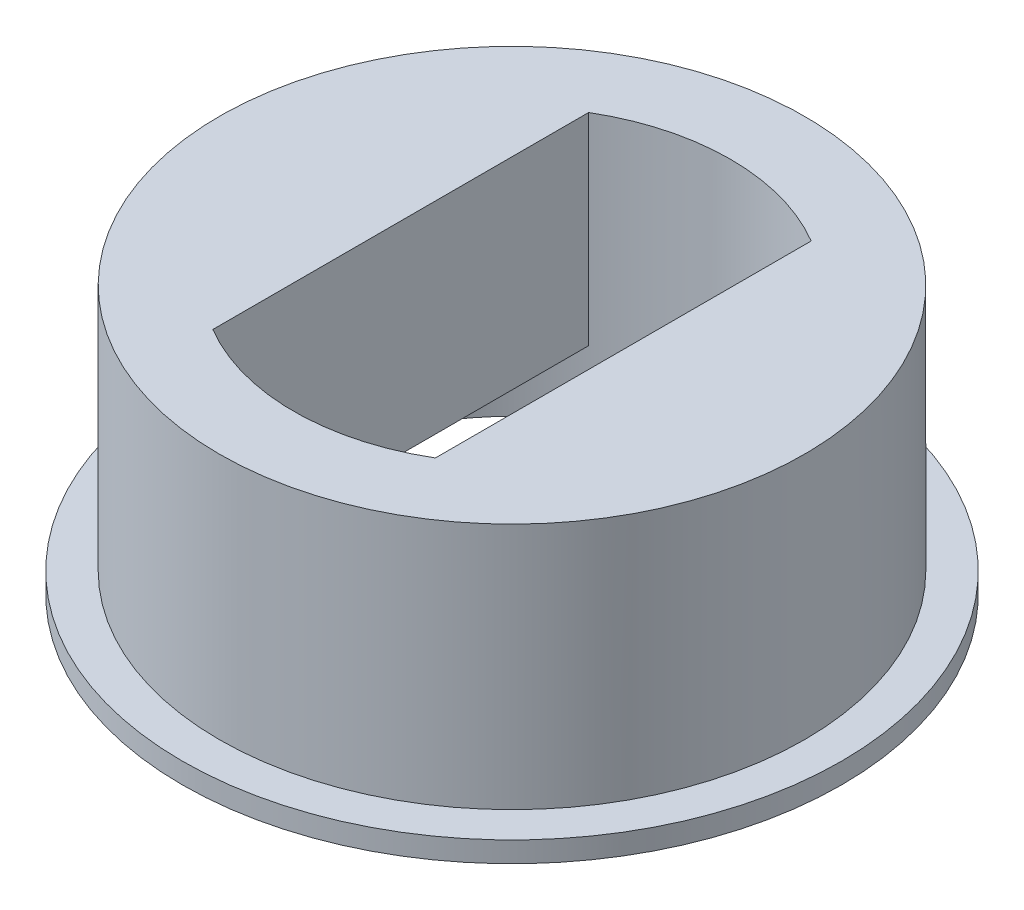
ISO-10303-21;
HEADER;
FILE_DESCRIPTION(('STEP AP214'),'2;1');
FILE_NAME('part.step','',(''),(''),'','','');
FILE_SCHEMA(('AUTOMOTIVE_DESIGN { 1 0 10303 214 1 1 1 1 }'));
ENDSEC;
DATA;
#1=APPLICATION_CONTEXT('core data for automotive mechanical design processes');
#2=APPLICATION_PROTOCOL_DEFINITION('international standard','automotive_design',2000,#1);
#3=PRODUCT_CONTEXT('',#1,'mechanical');
#4=PRODUCT('Part','Part','',(#3));
#5=PRODUCT_RELATED_PRODUCT_CATEGORY('part','',(#4));
#6=PRODUCT_DEFINITION_FORMATION('','',#4);
#7=PRODUCT_DEFINITION_CONTEXT('part definition',#1,'design');
#8=PRODUCT_DEFINITION('design','',#6,#7);
#9=PRODUCT_DEFINITION_SHAPE('','',#8);
#10=(LENGTH_UNIT() NAMED_UNIT(*) SI_UNIT(.MILLI.,.METRE.));
#11=(NAMED_UNIT(*) PLANE_ANGLE_UNIT() SI_UNIT($,.RADIAN.));
#12=(NAMED_UNIT(*) SI_UNIT($,.STERADIAN.) SOLID_ANGLE_UNIT());
#13=UNCERTAINTY_MEASURE_WITH_UNIT(LENGTH_MEASURE(1.E-05),#10,'distance_accuracy_value','');
#14=(GEOMETRIC_REPRESENTATION_CONTEXT(3) GLOBAL_UNCERTAINTY_ASSIGNED_CONTEXT((#13)) GLOBAL_UNIT_ASSIGNED_CONTEXT((#10,
#11,#12)) REPRESENTATION_CONTEXT('',''));
#15=CARTESIAN_POINT('',(0.,0.,0.));
#16=DIRECTION('',(0.,0.,1.));
#17=DIRECTION('',(1.,0.,0.));
#18=AXIS2_PLACEMENT_3D('',#15,#16,#17);
#19=CARTESIAN_POINT('',(0.,7.,0.));
#20=DIRECTION('',(0.,1.,0.));
#21=DIRECTION('',(0.,0.,1.));
#22=AXIS2_PLACEMENT_3D('',#19,#20,#21);
#23=PLANE('',#22);
#24=CARTESIAN_POINT('',(0.,7.,0.));
#25=DIRECTION('',(0.,1.,0.));
#26=DIRECTION('',(0.,0.,1.));
#27=AXIS2_PLACEMENT_3D('',#24,#25,#26);
#28=CIRCLE('',#27,7.1);
#29=CARTESIAN_POINT('',(0.,7.,7.1));
#30=VERTEX_POINT('',#29);
#31=EDGE_CURVE('E114',#30,#30,#28,.T.);
#32=ORIENTED_EDGE('',*,*,#31,.T.);
#33=EDGE_LOOP('',(#32));
#34=FACE_BOUND('',#33,.T.);
#35=DIRECTION('',(0.,0.,1.));
#36=VECTOR('',#35,1.);
#37=CARTESIAN_POINT('',(-2.7,7.,0.));
#38=LINE('',#37,#36);
#39=CARTESIAN_POINT('',(-2.7,7.,-4.55911584030947));
#40=VERTEX_POINT('',#39);
#41=CARTESIAN_POINT('',(-2.7,7.,4.55911584030947));
#42=VERTEX_POINT('',#41);
#43=EDGE_CURVE('E11',#40,#42,#38,.T.);
#44=ORIENTED_EDGE('',*,*,#43,.F.);
#45=CARTESIAN_POINT('',(0.,7.,0.));
#46=DIRECTION('',(0.,1.,0.));
#47=DIRECTION('',(0.,0.,1.));
#48=AXIS2_PLACEMENT_3D('',#45,#46,#47);
#49=CIRCLE('',#48,5.29863541351551);
#50=CARTESIAN_POINT('',(2.7,7.,-4.55911584030947));
#51=VERTEX_POINT('',#50);
#52=EDGE_CURVE('E106',#51,#40,#49,.T.);
#53=ORIENTED_EDGE('',*,*,#52,.F.);
#54=DIRECTION('',(0.,0.,1.));
#55=VECTOR('',#54,1.);
#56=CARTESIAN_POINT('',(2.7,7.,0.));
#57=LINE('',#56,#55);
#58=CARTESIAN_POINT('',(2.7,7.,4.55911584030947));
#59=VERTEX_POINT('',#58);
#60=EDGE_CURVE('E46',#51,#59,#57,.T.);
#61=ORIENTED_EDGE('',*,*,#60,.T.);
#62=CARTESIAN_POINT('',(0.,7.,0.));
#63=DIRECTION('',(0.,1.,0.));
#64=DIRECTION('',(0.,0.,1.));
#65=AXIS2_PLACEMENT_3D('',#62,#63,#64);
#66=CIRCLE('',#65,5.29863541351551);
#67=EDGE_CURVE('E91',#42,#59,#66,.T.);
#68=ORIENTED_EDGE('',*,*,#67,.F.);
#69=EDGE_LOOP('',(#44,#53,#61,#68));
#70=FACE_BOUND('',#69,.T.);
#71=ADVANCED_FACE('F38',(#34,#70),#23,.T.);
#72=CARTESIAN_POINT('',(0.,2.1,0.));
#73=DIRECTION('',(0.,-1.,0.));
#74=DIRECTION('',(0.,0.,-1.));
#75=AXIS2_PLACEMENT_3D('',#72,#73,#74);
#76=PLANE('',#75);
#77=CARTESIAN_POINT('',(0.,2.1,0.));
#78=DIRECTION('',(0.,-1.,0.));
#79=DIRECTION('',(0.,0.,-1.));
#80=AXIS2_PLACEMENT_3D('',#77,#78,#79);
#81=CIRCLE('',#80,5.29863541351551);
#82=CARTESIAN_POINT('',(-2.7,2.1,4.55911584030947));
#83=VERTEX_POINT('',#82);
#84=CARTESIAN_POINT('',(-2.7,2.1,-4.55911584030947));
#85=VERTEX_POINT('',#84);
#86=EDGE_CURVE('E99',#83,#85,#81,.T.);
#87=ORIENTED_EDGE('',*,*,#86,.T.);
#88=DIRECTION('',(0.,0.,1.));
#89=VECTOR('',#88,1.);
#90=CARTESIAN_POINT('',(-2.7,2.1,0.));
#91=LINE('',#90,#89);
#92=EDGE_CURVE('E53',#85,#83,#91,.T.);
#93=ORIENTED_EDGE('',*,*,#92,.T.);
#94=EDGE_LOOP('',(#87,#93));
#95=FACE_BOUND('',#94,.T.);
#96=ADVANCED_FACE('F142',(#95),#76,.T.);
#97=DIRECTION('',(0.,0.,1.));
#98=VECTOR('',#97,1.);
#99=CARTESIAN_POINT('',(2.7,2.1,0.));
#100=LINE('',#99,#98);
#101=CARTESIAN_POINT('',(2.7,2.1,-4.55911584030947));
#102=VERTEX_POINT('',#101);
#103=CARTESIAN_POINT('',(2.7,2.1,4.55911584030947));
#104=VERTEX_POINT('',#103);
#105=EDGE_CURVE('E61',#102,#104,#100,.T.);
#106=ORIENTED_EDGE('',*,*,#105,.F.);
#107=EDGE_CURVE('E81',#102,#104,#81,.T.);
#108=ORIENTED_EDGE('',*,*,#107,.T.);
#109=EDGE_LOOP('',(#106,#108));
#110=FACE_BOUND('',#109,.T.);
#111=ADVANCED_FACE('F79',(#110),#76,.T.);
#112=CARTESIAN_POINT('',(-2.7,10.,0.));
#113=DIRECTION('',(-1.,0.,0.));
#114=DIRECTION('',(0.,0.,1.));
#115=AXIS2_PLACEMENT_3D('',#112,#113,#114);
#116=PLANE('',#115);
#117=ORIENTED_EDGE('',*,*,#92,.F.);
#118=DIRECTION('',(0.,-1.,0.));
#119=VECTOR('',#118,1.);
#120=CARTESIAN_POINT('',(-2.7,12.7,-4.55911584030947));
#121=LINE('',#120,#119);
#122=EDGE_CURVE('E92',#40,#85,#121,.T.);
#123=ORIENTED_EDGE('',*,*,#122,.F.);
#124=ORIENTED_EDGE('',*,*,#43,.T.);
#125=DIRECTION('',(0.,-1.,0.));
#126=VECTOR('',#125,1.);
#127=CARTESIAN_POINT('',(-2.7,12.7,4.55911584030947));
#128=LINE('',#127,#126);
#129=EDGE_CURVE('E133',#42,#83,#128,.T.);
#130=ORIENTED_EDGE('',*,*,#129,.T.);
#131=EDGE_LOOP('',(#117,#123,#124,#130));
#132=FACE_BOUND('',#131,.T.);
#133=ADVANCED_FACE('F143',(#132),#116,.F.);
#134=CARTESIAN_POINT('',(2.7,10.,0.));
#135=DIRECTION('',(-1.,0.,0.));
#136=DIRECTION('',(0.,0.,1.));
#137=AXIS2_PLACEMENT_3D('',#134,#135,#136);
#138=PLANE('',#137);
#139=ORIENTED_EDGE('',*,*,#60,.F.);
#140=DIRECTION('',(0.,-1.,0.));
#141=VECTOR('',#140,1.);
#142=CARTESIAN_POINT('',(2.7,12.7,-4.55911584030947));
#143=LINE('',#142,#141);
#144=EDGE_CURVE('E85',#51,#102,#143,.T.);
#145=ORIENTED_EDGE('',*,*,#144,.T.);
#146=ORIENTED_EDGE('',*,*,#105,.T.);
#147=DIRECTION('',(0.,-1.,0.));
#148=VECTOR('',#147,1.);
#149=CARTESIAN_POINT('',(2.7,12.7,4.55911584030947));
#150=LINE('',#149,#148);
#151=EDGE_CURVE('E97',#59,#104,#150,.T.);
#152=ORIENTED_EDGE('',*,*,#151,.F.);
#153=EDGE_LOOP('',(#139,#145,#146,#152));
#154=FACE_BOUND('',#153,.T.);
#155=ADVANCED_FACE('F86',(#154),#138,.T.);
#156=CARTESIAN_POINT('',(0.,1.,0.));
#157=DIRECTION('',(0.,-1.,0.));
#158=DIRECTION('',(0.,0.,-1.));
#159=AXIS2_PLACEMENT_3D('',#156,#157,#158);
#160=CYLINDRICAL_SURFACE('',#159,8.);
#161=CARTESIAN_POINT('',(0.,1.,0.));
#162=DIRECTION('',(0.,-1.,0.));
#163=DIRECTION('',(0.,0.,-1.));
#164=AXIS2_PLACEMENT_3D('',#161,#162,#163);
#165=CIRCLE('',#164,8.);
#166=CARTESIAN_POINT('',(0.,1.,-8.));
#167=VERTEX_POINT('',#166);
#168=EDGE_CURVE('E125',#167,#167,#165,.T.);
#169=ORIENTED_EDGE('',*,*,#168,.T.);
#170=EDGE_LOOP('',(#169));
#171=FACE_BOUND('',#170,.T.);
#172=CARTESIAN_POINT('',(0.,0.5,0.));
#173=DIRECTION('',(0.,-1.,0.));
#174=DIRECTION('',(0.,0.,-1.));
#175=AXIS2_PLACEMENT_3D('',#172,#173,#174);
#176=CIRCLE('',#175,8.);
#177=CARTESIAN_POINT('',(0.,0.5,-8.));
#178=VERTEX_POINT('',#177);
#179=EDGE_CURVE('E118',#178,#178,#176,.T.);
#180=ORIENTED_EDGE('',*,*,#179,.F.);
#181=EDGE_LOOP('',(#180));
#182=FACE_BOUND('',#181,.T.);
#183=ADVANCED_FACE('F149',(#171,#182),#160,.T.);
#184=CARTESIAN_POINT('',(0.,1.,0.));
#185=DIRECTION('',(0.,-1.,0.));
#186=DIRECTION('',(0.,0.,-1.));
#187=AXIS2_PLACEMENT_3D('',#184,#185,#186);
#188=PLANE('',#187);
#189=CARTESIAN_POINT('',(0.,1.,0.));
#190=DIRECTION('',(0.,-1.,0.));
#191=DIRECTION('',(0.,0.,-1.));
#192=AXIS2_PLACEMENT_3D('',#189,#190,#191);
#193=CIRCLE('',#192,7.1);
#194=CARTESIAN_POINT('',(0.,1.,-7.1));
#195=VERTEX_POINT('',#194);
#196=EDGE_CURVE('E113',#195,#195,#193,.F.);
#197=ORIENTED_EDGE('',*,*,#196,.F.);
#198=EDGE_LOOP('',(#197));
#199=FACE_BOUND('',#198,.T.);
#200=ORIENTED_EDGE('',*,*,#168,.F.);
#201=EDGE_LOOP('',(#200));
#202=FACE_BOUND('',#201,.T.);
#203=ADVANCED_FACE('F168',(#199,#202),#188,.F.);
#204=CARTESIAN_POINT('',(0.,0.5,0.));
#205=DIRECTION('',(0.,-1.,0.));
#206=DIRECTION('',(0.,0.,-1.));
#207=AXIS2_PLACEMENT_3D('',#204,#205,#206);
#208=PLANE('',#207);
#209=CARTESIAN_POINT('',(0.,0.5,0.));
#210=DIRECTION('',(0.,-1.,0.));
#211=DIRECTION('',(0.,0.,-1.));
#212=AXIS2_PLACEMENT_3D('',#209,#210,#211);
#213=CIRCLE('',#212,5.29863541351551);
#214=CARTESIAN_POINT('',(0.,0.5,-5.29863541351551));
#215=VERTEX_POINT('',#214);
#216=EDGE_CURVE('E103',#215,#215,#213,.T.);
#217=ORIENTED_EDGE('',*,*,#216,.F.);
#218=EDGE_LOOP('',(#217));
#219=FACE_BOUND('',#218,.T.);
#220=ORIENTED_EDGE('',*,*,#179,.T.);
#221=EDGE_LOOP('',(#220));
#222=FACE_BOUND('',#221,.T.);
#223=ADVANCED_FACE('F164',(#219,#222),#208,.T.);
#224=CARTESIAN_POINT('',(0.,-19.081832585698,0.));
#225=DIRECTION('',(0.,1.,0.));
#226=DIRECTION('',(0.,0.,1.));
#227=AXIS2_PLACEMENT_3D('',#224,#225,#226);
#228=CYLINDRICAL_SURFACE('',#227,7.1);
#229=ORIENTED_EDGE('',*,*,#31,.F.);
#230=EDGE_LOOP('',(#229));
#231=FACE_BOUND('',#230,.T.);
#232=ORIENTED_EDGE('',*,*,#196,.T.);
#233=EDGE_LOOP('',(#232));
#234=FACE_BOUND('',#233,.T.);
#235=ADVANCED_FACE('F161',(#231,#234),#228,.T.);
#236=CARTESIAN_POINT('',(0.,2.1,0.));
#237=DIRECTION('',(0.,-1.,0.));
#238=DIRECTION('',(0.,0.,-1.));
#239=AXIS2_PLACEMENT_3D('',#236,#237,#238);
#240=CYLINDRICAL_SURFACE('',#239,5.29863541351551);
#241=ORIENTED_EDGE('',*,*,#107,.F.);
#242=ORIENTED_EDGE('',*,*,#144,.F.);
#243=ORIENTED_EDGE('',*,*,#52,.T.);
#244=ORIENTED_EDGE('',*,*,#122,.T.);
#245=ORIENTED_EDGE('',*,*,#86,.F.);
#246=ORIENTED_EDGE('',*,*,#129,.F.);
#247=ORIENTED_EDGE('',*,*,#67,.T.);
#248=ORIENTED_EDGE('',*,*,#151,.T.);
#249=EDGE_LOOP('',(#241,#242,#243,#244,#245,#246,#247,#248));
#250=FACE_BOUND('',#249,.T.);
#251=ORIENTED_EDGE('',*,*,#216,.T.);
#252=EDGE_LOOP('',(#251));
#253=FACE_BOUND('',#252,.T.);
#254=ADVANCED_FACE('F94',(#250,#253),#240,.F.);
#255=CLOSED_SHELL('',(#71,#96,#111,#133,#155,#183,#203,#223,#235,#254));
#256=MANIFOLD_SOLID_BREP('B2',#255);
#257=ADVANCED_BREP_SHAPE_REPRESENTATION('',(#18,#256),#14);
#258=SHAPE_DEFINITION_REPRESENTATION(#9,#257);
ENDSEC;
END-ISO-10303-21;
